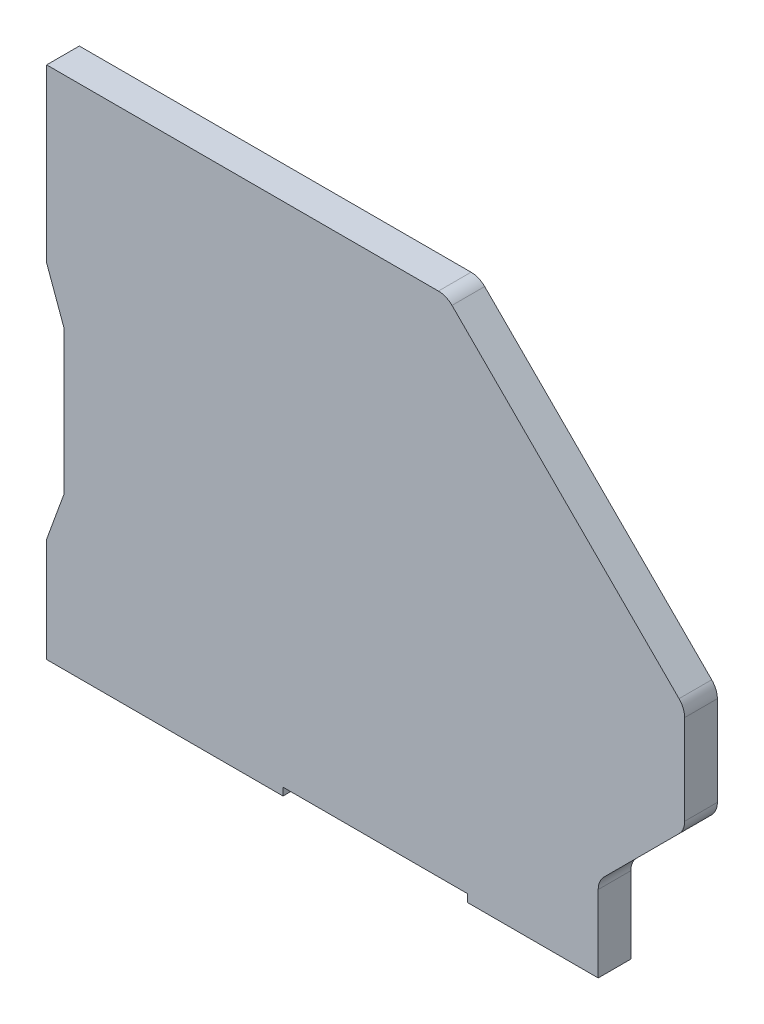
ISO-10303-21;
HEADER;
FILE_DESCRIPTION(('STEP AP214'),'2;1');
FILE_NAME('part.step','',(''),(''),'','','');
FILE_SCHEMA(('AUTOMOTIVE_DESIGN { 1 0 10303 214 1 1 1 1 }'));
ENDSEC;
DATA;
#1=APPLICATION_CONTEXT('core data for automotive mechanical design processes');
#2=APPLICATION_PROTOCOL_DEFINITION('international standard','automotive_design',2000,#1);
#3=PRODUCT_CONTEXT('',#1,'mechanical');
#4=PRODUCT('Part','Part','',(#3));
#5=PRODUCT_RELATED_PRODUCT_CATEGORY('part','',(#4));
#6=PRODUCT_DEFINITION_FORMATION('','',#4);
#7=PRODUCT_DEFINITION_CONTEXT('part definition',#1,'design');
#8=PRODUCT_DEFINITION('design','',#6,#7);
#9=PRODUCT_DEFINITION_SHAPE('','',#8);
#10=(LENGTH_UNIT() NAMED_UNIT(*) SI_UNIT(.MILLI.,.METRE.));
#11=(NAMED_UNIT(*) PLANE_ANGLE_UNIT() SI_UNIT($,.RADIAN.));
#12=(NAMED_UNIT(*) SI_UNIT($,.STERADIAN.) SOLID_ANGLE_UNIT());
#13=UNCERTAINTY_MEASURE_WITH_UNIT(LENGTH_MEASURE(1.E-05),#10,'distance_accuracy_value','');
#14=(GEOMETRIC_REPRESENTATION_CONTEXT(3) GLOBAL_UNCERTAINTY_ASSIGNED_CONTEXT((#13)) GLOBAL_UNIT_ASSIGNED_CONTEXT((#10,
#11,#12)) REPRESENTATION_CONTEXT('',''));
#15=CARTESIAN_POINT('',(0.,0.,0.));
#16=DIRECTION('',(0.,0.,1.));
#17=DIRECTION('',(1.,0.,0.));
#18=AXIS2_PLACEMENT_3D('',#15,#16,#17);
#19=CARTESIAN_POINT('',(-2.6,0.,0.));
#20=DIRECTION('',(-1.,0.,0.));
#21=DIRECTION('',(0.,0.,1.));
#22=AXIS2_PLACEMENT_3D('',#19,#20,#21);
#23=PLANE('',#22);
#24=DIRECTION('',(0.,1.,0.));
#25=VECTOR('',#24,1.);
#26=CARTESIAN_POINT('',(-2.6,0.,0.));
#27=LINE('',#26,#25);
#28=CARTESIAN_POINT('',(-2.6,0.4,0.));
#29=VERTEX_POINT('',#28);
#30=CARTESIAN_POINT('',(-2.6,0.,0.));
#31=VERTEX_POINT('',#30);
#32=EDGE_CURVE('E157',#29,#31,#27,.F.);
#33=ORIENTED_EDGE('',*,*,#32,.T.);
#34=DIRECTION('',(0.,0.,-1.));
#35=VECTOR('',#34,1.);
#36=CARTESIAN_POINT('',(-2.6,0.,0.));
#37=LINE('',#36,#35);
#38=CARTESIAN_POINT('',(-2.6,0.,1.7));
#39=VERTEX_POINT('',#38);
#40=EDGE_CURVE('E240',#39,#31,#37,.T.);
#41=ORIENTED_EDGE('',*,*,#40,.F.);
#42=DIRECTION('',(0.,1.,0.));
#43=VECTOR('',#42,1.);
#44=CARTESIAN_POINT('',(-2.6,12.6002823694556,1.7));
#45=LINE('',#44,#43);
#46=CARTESIAN_POINT('',(-2.6,0.399999999999999,1.7));
#47=VERTEX_POINT('',#46);
#48=EDGE_CURVE('E285',#47,#39,#45,.F.);
#49=ORIENTED_EDGE('',*,*,#48,.F.);
#50=DIRECTION('',(0.,0.,-1.));
#51=VECTOR('',#50,1.);
#52=CARTESIAN_POINT('',(-2.6,0.4,0.));
#53=LINE('',#52,#51);
#54=EDGE_CURVE('E249',#29,#47,#53,.F.);
#55=ORIENTED_EDGE('',*,*,#54,.F.);
#56=EDGE_LOOP('',(#33,#41,#49,#55));
#57=FACE_BOUND('',#56,.T.);
#58=ADVANCED_FACE('F16',(#57),#23,.T.);
#59=CARTESIAN_POINT('',(5.19999999999982,3.98578643762698,0.));
#60=DIRECTION('',(0.,0.,1.));
#61=DIRECTION('',(1.,0.,0.));
#62=AXIS2_PLACEMENT_3D('',#59,#60,#61);
#63=CYLINDRICAL_SURFACE('',#62,0.999999999999821);
#64=DIRECTION('',(0.,0.,-1.));
#65=VECTOR('',#64,1.);
#66=CARTESIAN_POINT('',(4.2,3.9857864376269,0.));
#67=LINE('',#66,#65);
#68=CARTESIAN_POINT('',(4.2,3.98578643762694,0.));
#69=VERTEX_POINT('',#68);
#70=CARTESIAN_POINT('',(4.2,3.98578643762694,1.7));
#71=VERTEX_POINT('',#70);
#72=EDGE_CURVE('E159',#69,#71,#67,.F.);
#73=ORIENTED_EDGE('',*,*,#72,.F.);
#74=CARTESIAN_POINT('',(5.19999999999982,3.98578643762698,0.));
#75=DIRECTION('',(0.,0.,1.));
#76=DIRECTION('',(1.,0.,0.));
#77=AXIS2_PLACEMENT_3D('',#74,#75,#76);
#78=CIRCLE('',#77,0.999999999999821);
#79=CARTESIAN_POINT('',(4.49289321881345,4.69289321881344,0.));
#80=VERTEX_POINT('',#79);
#81=EDGE_CURVE('E19',#80,#69,#78,.T.);
#82=ORIENTED_EDGE('',*,*,#81,.F.);
#83=DIRECTION('',(0.,0.,1.));
#84=VECTOR('',#83,1.);
#85=CARTESIAN_POINT('',(4.4928932188135,4.6928932188135,0.));
#86=LINE('',#85,#84);
#87=CARTESIAN_POINT('',(4.49289321881345,4.69289321881344,1.7));
#88=VERTEX_POINT('',#87);
#89=EDGE_CURVE('E229',#88,#80,#86,.F.);
#90=ORIENTED_EDGE('',*,*,#89,.F.);
#91=CARTESIAN_POINT('',(5.19999999999982,3.98578643762698,1.7));
#92=DIRECTION('',(0.,0.,1.));
#93=DIRECTION('',(1.,0.,0.));
#94=AXIS2_PLACEMENT_3D('',#91,#92,#93);
#95=CIRCLE('',#94,0.999999999999821);
#96=EDGE_CURVE('E161',#71,#88,#95,.F.);
#97=ORIENTED_EDGE('',*,*,#96,.F.);
#98=EDGE_LOOP('',(#73,#82,#90,#97));
#99=FACE_BOUND('',#98,.T.);
#100=ADVANCED_FACE('F160',(#99),#63,.F.);
#101=CARTESIAN_POINT('',(7.70000000000064,9.31421356237293,0.));
#102=DIRECTION('',(0.,0.,1.));
#103=DIRECTION('',(1.,0.,0.));
#104=AXIS2_PLACEMENT_3D('',#101,#102,#103);
#105=CYLINDRICAL_SURFACE('',#104,0.999999999999356);
#106=CARTESIAN_POINT('',(7.70000000000064,9.31421356237293,0.));
#107=DIRECTION('',(0.,0.,1.));
#108=DIRECTION('',(1.,0.,0.));
#109=AXIS2_PLACEMENT_3D('',#106,#107,#108);
#110=CIRCLE('',#109,0.999999999999356);
#111=CARTESIAN_POINT('',(8.40710678118662,8.60710678118672,0.));
#112=VERTEX_POINT('',#111);
#113=CARTESIAN_POINT('',(8.7,9.31421356237301,0.));
#114=VERTEX_POINT('',#113);
#115=EDGE_CURVE('E156',#112,#114,#110,.T.);
#116=ORIENTED_EDGE('',*,*,#115,.T.);
#117=DIRECTION('',(0.,0.,-1.));
#118=VECTOR('',#117,1.);
#119=CARTESIAN_POINT('',(8.7,9.3142135623731,0.));
#120=LINE('',#119,#118);
#121=CARTESIAN_POINT('',(8.7,9.31421356237301,1.7));
#122=VERTEX_POINT('',#121);
#123=EDGE_CURVE('E222',#122,#114,#120,.T.);
#124=ORIENTED_EDGE('',*,*,#123,.F.);
#125=CARTESIAN_POINT('',(7.70000000000064,9.31421356237293,1.7));
#126=DIRECTION('',(0.,0.,1.));
#127=DIRECTION('',(1.,0.,0.));
#128=AXIS2_PLACEMENT_3D('',#125,#126,#127);
#129=CIRCLE('',#128,0.999999999999356);
#130=CARTESIAN_POINT('',(8.40710678118662,8.60710678118672,1.7));
#131=VERTEX_POINT('',#130);
#132=EDGE_CURVE('E304',#131,#122,#129,.T.);
#133=ORIENTED_EDGE('',*,*,#132,.F.);
#134=DIRECTION('',(0.,0.,1.));
#135=VECTOR('',#134,1.);
#136=CARTESIAN_POINT('',(8.4071067811865,8.6071067811866,0.));
#137=LINE('',#136,#135);
#138=EDGE_CURVE('E231',#112,#131,#137,.T.);
#139=ORIENTED_EDGE('',*,*,#138,.F.);
#140=EDGE_LOOP('',(#116,#124,#133,#139));
#141=FACE_BOUND('',#140,.T.);
#142=ADVANCED_FACE('F312',(#141),#105,.T.);
#143=CARTESIAN_POINT('',(7.7000000000025,13.9857864376274,0.));
#144=DIRECTION('',(0.,0.,1.));
#145=DIRECTION('',(1.,0.,0.));
#146=AXIS2_PLACEMENT_3D('',#143,#144,#145);
#147=CYLINDRICAL_SURFACE('',#146,0.9999999999975);
#148=CARTESIAN_POINT('',(7.7000000000025,13.9857864376274,0.));
#149=DIRECTION('',(0.,0.,1.));
#150=DIRECTION('',(1.,0.,0.));
#151=AXIS2_PLACEMENT_3D('',#148,#149,#150);
#152=CIRCLE('',#151,0.9999999999975);
#153=CARTESIAN_POINT('',(8.7,13.9857864376272,0.));
#154=VERTEX_POINT('',#153);
#155=CARTESIAN_POINT('',(8.4071067811869,14.6928932188126,0.));
#156=VERTEX_POINT('',#155);
#157=EDGE_CURVE('E308',#154,#156,#152,.T.);
#158=ORIENTED_EDGE('',*,*,#157,.T.);
#159=DIRECTION('',(0.,0.,1.));
#160=VECTOR('',#159,1.);
#161=CARTESIAN_POINT('',(8.4071067811865,14.692893218813,0.));
#162=LINE('',#161,#160);
#163=CARTESIAN_POINT('',(8.4071067811869,14.6928932188126,1.7));
#164=VERTEX_POINT('',#163);
#165=EDGE_CURVE('E215',#164,#156,#162,.F.);
#166=ORIENTED_EDGE('',*,*,#165,.F.);
#167=CARTESIAN_POINT('',(7.7000000000025,13.9857864376274,1.7));
#168=DIRECTION('',(0.,0.,1.));
#169=DIRECTION('',(1.,0.,0.));
#170=AXIS2_PLACEMENT_3D('',#167,#168,#169);
#171=CIRCLE('',#170,0.9999999999975);
#172=CARTESIAN_POINT('',(8.7,13.9857864376272,1.7));
#173=VERTEX_POINT('',#172);
#174=EDGE_CURVE('E302',#173,#164,#171,.T.);
#175=ORIENTED_EDGE('',*,*,#174,.F.);
#176=DIRECTION('',(0.,0.,-1.));
#177=VECTOR('',#176,1.);
#178=CARTESIAN_POINT('',(8.7,13.985786437627,0.));
#179=LINE('',#178,#177);
#180=EDGE_CURVE('E225',#154,#173,#179,.F.);
#181=ORIENTED_EDGE('',*,*,#180,.F.);
#182=EDGE_LOOP('',(#158,#166,#175,#181));
#183=FACE_BOUND('',#182,.T.);
#184=ADVANCED_FACE('F373',(#183),#147,.T.);
#185=CARTESIAN_POINT('',(-4.11421356237489,25.7999999999944,0.));
#186=DIRECTION('',(0.,0.,1.));
#187=DIRECTION('',(1.,0.,0.));
#188=AXIS2_PLACEMENT_3D('',#185,#186,#187);
#189=CYLINDRICAL_SURFACE('',#188,1.00000000000555);
#190=CARTESIAN_POINT('',(-4.11421356237489,25.7999999999944,0.));
#191=DIRECTION('',(0.,0.,1.));
#192=DIRECTION('',(1.,0.,0.));
#193=AXIS2_PLACEMENT_3D('',#190,#191,#192);
#194=CIRCLE('',#193,1.00000000000555);
#195=CARTESIAN_POINT('',(-3.40710678118544,26.507106781186,0.));
#196=VERTEX_POINT('',#195);
#197=CARTESIAN_POINT('',(-4.114213562374,26.8,0.));
#198=VERTEX_POINT('',#197);
#199=EDGE_CURVE('E287',#196,#198,#194,.T.);
#200=ORIENTED_EDGE('',*,*,#199,.T.);
#201=DIRECTION('',(0.,0.,1.));
#202=VECTOR('',#201,1.);
#203=CARTESIAN_POINT('',(-4.1142135623731,26.8,0.));
#204=LINE('',#203,#202);
#205=CARTESIAN_POINT('',(-4.114213562374,26.8,1.7));
#206=VERTEX_POINT('',#205);
#207=EDGE_CURVE('E198',#206,#198,#204,.F.);
#208=ORIENTED_EDGE('',*,*,#207,.F.);
#209=CARTESIAN_POINT('',(-4.11421356237489,25.7999999999944,1.7));
#210=DIRECTION('',(0.,0.,1.));
#211=DIRECTION('',(1.,0.,0.));
#212=AXIS2_PLACEMENT_3D('',#209,#210,#211);
#213=CIRCLE('',#212,1.00000000000555);
#214=CARTESIAN_POINT('',(-3.40710678118544,26.507106781186,1.7));
#215=VERTEX_POINT('',#214);
#216=EDGE_CURVE('E255',#215,#206,#213,.T.);
#217=ORIENTED_EDGE('',*,*,#216,.F.);
#218=DIRECTION('',(0.,0.,1.));
#219=VECTOR('',#218,1.);
#220=CARTESIAN_POINT('',(-3.4071067811865,26.507106781187,0.));
#221=LINE('',#220,#219);
#222=EDGE_CURVE('E218',#196,#215,#221,.T.);
#223=ORIENTED_EDGE('',*,*,#222,.F.);
#224=EDGE_LOOP('',(#200,#208,#217,#223));
#225=FACE_BOUND('',#224,.T.);
#226=ADVANCED_FACE('F366',(#225),#189,.T.);
#227=CARTESIAN_POINT('',(-9.8639304558619,12.6002823694556,1.7));
#228=DIRECTION('',(0.,0.,1.));
#229=DIRECTION('',(1.,0.,0.));
#230=AXIS2_PLACEMENT_3D('',#227,#228,#229);
#231=PLANE('',#230);
#232=DIRECTION('',(0.,1.,0.));
#233=VECTOR('',#232,1.);
#234=CARTESIAN_POINT('',(-23.6,7.9,1.7));
#235=LINE('',#234,#233);
#236=CARTESIAN_POINT('',(-23.6,7.9,1.7));
#237=VERTEX_POINT('',#236);
#238=CARTESIAN_POINT('',(-23.6,15.4,1.7));
#239=VERTEX_POINT('',#238);
#240=EDGE_CURVE('E195',#237,#239,#235,.T.);
#241=ORIENTED_EDGE('',*,*,#240,.F.);
#242=DIRECTION('',(-0.342020143325663,-0.93969262078591,0.));
#243=VECTOR('',#242,1.);
#244=CARTESIAN_POINT('',(-24.5,5.4272703224908,1.7));
#245=LINE('',#244,#243);
#246=CARTESIAN_POINT('',(-24.5,5.4272703224908,1.7));
#247=VERTEX_POINT('',#246);
#248=EDGE_CURVE('E191',#247,#237,#245,.F.);
#249=ORIENTED_EDGE('',*,*,#248,.F.);
#250=DIRECTION('',(0.,1.,0.));
#251=VECTOR('',#250,1.);
#252=CARTESIAN_POINT('',(-24.5,0.,1.7));
#253=LINE('',#252,#251);
#254=CARTESIAN_POINT('',(-24.5,0.,1.7));
#255=VERTEX_POINT('',#254);
#256=EDGE_CURVE('E187',#255,#247,#253,.T.);
#257=ORIENTED_EDGE('',*,*,#256,.F.);
#258=DIRECTION('',(1.,0.,0.));
#259=VECTOR('',#258,1.);
#260=CARTESIAN_POINT('',(-12.2,0.,1.7));
#261=LINE('',#260,#259);
#262=CARTESIAN_POINT('',(-12.2,0.,1.7));
#263=VERTEX_POINT('',#262);
#264=EDGE_CURVE('E183',#263,#255,#261,.F.);
#265=ORIENTED_EDGE('',*,*,#264,.F.);
#266=DIRECTION('',(0.,1.,0.));
#267=VECTOR('',#266,1.);
#268=CARTESIAN_POINT('',(-12.2,0.4,1.7));
#269=LINE('',#268,#267);
#270=CARTESIAN_POINT('',(-12.2,0.4,1.7));
#271=VERTEX_POINT('',#270);
#272=EDGE_CURVE('E253',#271,#263,#269,.F.);
#273=ORIENTED_EDGE('',*,*,#272,.F.);
#274=DIRECTION('',(1.,0.,0.));
#275=VECTOR('',#274,1.);
#276=CARTESIAN_POINT('',(-2.6,0.4,1.7));
#277=LINE('',#276,#275);
#278=EDGE_CURVE('E250',#47,#271,#277,.F.);
#279=ORIENTED_EDGE('',*,*,#278,.F.);
#280=ORIENTED_EDGE('',*,*,#48,.T.);
#281=DIRECTION('',(1.,0.,0.));
#282=VECTOR('',#281,1.);
#283=CARTESIAN_POINT('',(4.2,0.,1.7));
#284=LINE('',#283,#282);
#285=CARTESIAN_POINT('',(4.2,0.,1.7));
#286=VERTEX_POINT('',#285);
#287=EDGE_CURVE('E243',#286,#39,#284,.F.);
#288=ORIENTED_EDGE('',*,*,#287,.F.);
#289=DIRECTION('',(0.,1.,0.));
#290=VECTOR('',#289,1.);
#291=CARTESIAN_POINT('',(4.2,3.9857864376269,1.7));
#292=LINE('',#291,#290);
#293=EDGE_CURVE('E235',#71,#286,#292,.F.);
#294=ORIENTED_EDGE('',*,*,#293,.F.);
#295=ORIENTED_EDGE('',*,*,#96,.T.);
#296=DIRECTION('',(0.707106781186538,0.707106781186557,0.));
#297=VECTOR('',#296,1.);
#298=CARTESIAN_POINT('',(8.4071067811865,8.6071067811866,1.7));
#299=LINE('',#298,#297);
#300=EDGE_CURVE('E164',#131,#88,#299,.F.);
#301=ORIENTED_EDGE('',*,*,#300,.F.);
#302=ORIENTED_EDGE('',*,*,#132,.T.);
#303=DIRECTION('',(0.,1.,0.));
#304=VECTOR('',#303,1.);
#305=CARTESIAN_POINT('',(8.7,13.985786437627,1.7));
#306=LINE('',#305,#304);
#307=EDGE_CURVE('E226',#173,#122,#306,.F.);
#308=ORIENTED_EDGE('',*,*,#307,.F.);
#309=ORIENTED_EDGE('',*,*,#174,.T.);
#310=DIRECTION('',(-0.707106781186517,0.707106781186578,0.));
#311=VECTOR('',#310,1.);
#312=CARTESIAN_POINT('',(-3.4071067811865,26.507106781187,1.7));
#313=LINE('',#312,#311);
#314=EDGE_CURVE('E219',#215,#164,#313,.F.);
#315=ORIENTED_EDGE('',*,*,#314,.F.);
#316=ORIENTED_EDGE('',*,*,#216,.T.);
#317=DIRECTION('',(1.,0.,0.));
#318=VECTOR('',#317,1.);
#319=CARTESIAN_POINT('',(-24.5,26.8,1.7));
#320=LINE('',#319,#318);
#321=CARTESIAN_POINT('',(-24.5,26.8,1.7));
#322=VERTEX_POINT('',#321);
#323=EDGE_CURVE('E202',#322,#206,#320,.T.);
#324=ORIENTED_EDGE('',*,*,#323,.F.);
#325=DIRECTION('',(0.,1.,0.));
#326=VECTOR('',#325,1.);
#327=CARTESIAN_POINT('',(-24.5,17.872729677509,1.7));
#328=LINE('',#327,#326);
#329=CARTESIAN_POINT('',(-24.5,17.872729677509,1.7));
#330=VERTEX_POINT('',#329);
#331=EDGE_CURVE('E201',#330,#322,#328,.T.);
#332=ORIENTED_EDGE('',*,*,#331,.F.);
#333=DIRECTION('',(0.342020143325688,-0.939692620785901,0.));
#334=VECTOR('',#333,1.);
#335=CARTESIAN_POINT('',(-23.6,15.4,1.7));
#336=LINE('',#335,#334);
#337=EDGE_CURVE('E212',#239,#330,#336,.F.);
#338=ORIENTED_EDGE('',*,*,#337,.F.);
#339=EDGE_LOOP('',(#241,#249,#257,#265,#273,#279,#280,#288,#294,#295,#301,#302,#308,#309,#315,
#316,#324,#332,#338));
#340=FACE_BOUND('',#339,.T.);
#341=ADVANCED_FACE('F375',(#340),#231,.T.);
#342=CARTESIAN_POINT('',(-12.2,0.4,0.));
#343=DIRECTION('',(1.,0.,0.));
#344=DIRECTION('',(0.,0.,-1.));
#345=AXIS2_PLACEMENT_3D('',#342,#343,#344);
#346=PLANE('',#345);
#347=DIRECTION('',(0.,1.,0.));
#348=VECTOR('',#347,1.);
#349=CARTESIAN_POINT('',(-12.2,0.4,0.));
#350=LINE('',#349,#348);
#351=CARTESIAN_POINT('',(-12.2,0.,0.));
#352=VERTEX_POINT('',#351);
#353=CARTESIAN_POINT('',(-12.2,0.4,0.));
#354=VERTEX_POINT('',#353);
#355=EDGE_CURVE('E251',#352,#354,#350,.T.);
#356=ORIENTED_EDGE('',*,*,#355,.T.);
#357=DIRECTION('',(0.,0.,-1.));
#358=VECTOR('',#357,1.);
#359=CARTESIAN_POINT('',(-12.2,0.4,0.));
#360=LINE('',#359,#358);
#361=EDGE_CURVE('E246',#271,#354,#360,.T.);
#362=ORIENTED_EDGE('',*,*,#361,.F.);
#363=ORIENTED_EDGE('',*,*,#272,.T.);
#364=DIRECTION('',(0.,0.,-1.));
#365=VECTOR('',#364,1.);
#366=CARTESIAN_POINT('',(-12.2,0.,0.));
#367=LINE('',#366,#365);
#368=EDGE_CURVE('E179',#352,#263,#367,.F.);
#369=ORIENTED_EDGE('',*,*,#368,.F.);
#370=EDGE_LOOP('',(#356,#362,#363,#369));
#371=FACE_BOUND('',#370,.T.);
#372=ADVANCED_FACE('F499',(#371),#346,.T.);
#373=CARTESIAN_POINT('',(-2.6,0.4,0.));
#374=DIRECTION('',(0.,-1.,0.));
#375=DIRECTION('',(0.,0.,-1.));
#376=AXIS2_PLACEMENT_3D('',#373,#374,#375);
#377=PLANE('',#376);
#378=DIRECTION('',(1.,0.,0.));
#379=VECTOR('',#378,1.);
#380=CARTESIAN_POINT('',(-9.86393045586191,0.399999999999999,0.));
#381=LINE('',#380,#379);
#382=EDGE_CURVE('E173',#354,#29,#381,.T.);
#383=ORIENTED_EDGE('',*,*,#382,.T.);
#384=ORIENTED_EDGE('',*,*,#54,.T.);
#385=ORIENTED_EDGE('',*,*,#278,.T.);
#386=ORIENTED_EDGE('',*,*,#361,.T.);
#387=EDGE_LOOP('',(#383,#384,#385,#386));
#388=FACE_BOUND('',#387,.T.);
#389=ADVANCED_FACE('F490',(#388),#377,.T.);
#390=CARTESIAN_POINT('',(4.2,0.,0.));
#391=DIRECTION('',(0.,-1.,0.));
#392=DIRECTION('',(0.,0.,-1.));
#393=AXIS2_PLACEMENT_3D('',#390,#391,#392);
#394=PLANE('',#393);
#395=DIRECTION('',(1.,0.,0.));
#396=VECTOR('',#395,1.);
#397=CARTESIAN_POINT('',(-9.86393045586191,0.,0.));
#398=LINE('',#397,#396);
#399=CARTESIAN_POINT('',(4.2,0.,0.));
#400=VERTEX_POINT('',#399);
#401=EDGE_CURVE('E169',#31,#400,#398,.T.);
#402=ORIENTED_EDGE('',*,*,#401,.T.);
#403=DIRECTION('',(0.,0.,-1.));
#404=VECTOR('',#403,1.);
#405=CARTESIAN_POINT('',(4.2,0.,0.));
#406=LINE('',#405,#404);
#407=EDGE_CURVE('E165',#286,#400,#406,.T.);
#408=ORIENTED_EDGE('',*,*,#407,.F.);
#409=ORIENTED_EDGE('',*,*,#287,.T.);
#410=ORIENTED_EDGE('',*,*,#40,.T.);
#411=EDGE_LOOP('',(#402,#408,#409,#410));
#412=FACE_BOUND('',#411,.T.);
#413=ADVANCED_FACE('F387',(#412),#394,.T.);
#414=CARTESIAN_POINT('',(4.2,3.9857864376269,0.));
#415=DIRECTION('',(1.,0.,0.));
#416=DIRECTION('',(0.,0.,-1.));
#417=AXIS2_PLACEMENT_3D('',#414,#415,#416);
#418=PLANE('',#417);
#419=DIRECTION('',(0.,1.,0.));
#420=VECTOR('',#419,1.);
#421=CARTESIAN_POINT('',(4.2,12.6002823694556,0.));
#422=LINE('',#421,#420);
#423=EDGE_CURVE('E152',#400,#69,#422,.T.);
#424=ORIENTED_EDGE('',*,*,#423,.T.);
#425=ORIENTED_EDGE('',*,*,#72,.T.);
#426=ORIENTED_EDGE('',*,*,#293,.T.);
#427=ORIENTED_EDGE('',*,*,#407,.T.);
#428=EDGE_LOOP('',(#424,#425,#426,#427));
#429=FACE_BOUND('',#428,.T.);
#430=ADVANCED_FACE('F167',(#429),#418,.T.);
#431=CARTESIAN_POINT('',(8.4071067811865,8.6071067811866,0.));
#432=DIRECTION('',(0.707106781186557,-0.707106781186538,0.));
#433=DIRECTION('',(0.707106781186538,0.707106781186557,0.));
#434=AXIS2_PLACEMENT_3D('',#431,#432,#433);
#435=PLANE('',#434);
#436=DIRECTION('',(0.707106781186538,0.707106781186557,0.));
#437=VECTOR('',#436,1.);
#438=CARTESIAN_POINT('',(4.4928932188135,4.6928932188135,0.));
#439=LINE('',#438,#437);
#440=EDGE_CURVE('E155',#80,#112,#439,.T.);
#441=ORIENTED_EDGE('',*,*,#440,.T.);
#442=ORIENTED_EDGE('',*,*,#138,.T.);
#443=ORIENTED_EDGE('',*,*,#300,.T.);
#444=ORIENTED_EDGE('',*,*,#89,.T.);
#445=EDGE_LOOP('',(#441,#442,#443,#444));
#446=FACE_BOUND('',#445,.T.);
#447=ADVANCED_FACE('F378',(#446),#435,.T.);
#448=CARTESIAN_POINT('',(8.7,13.985786437627,0.));
#449=DIRECTION('',(1.,0.,0.));
#450=DIRECTION('',(0.,0.,-1.));
#451=AXIS2_PLACEMENT_3D('',#448,#449,#450);
#452=PLANE('',#451);
#453=DIRECTION('',(0.,1.,0.));
#454=VECTOR('',#453,1.);
#455=CARTESIAN_POINT('',(8.7,12.6002823694556,0.));
#456=LINE('',#455,#454);
#457=EDGE_CURVE('E171',#114,#154,#456,.T.);
#458=ORIENTED_EDGE('',*,*,#457,.T.);
#459=ORIENTED_EDGE('',*,*,#180,.T.);
#460=ORIENTED_EDGE('',*,*,#307,.T.);
#461=ORIENTED_EDGE('',*,*,#123,.T.);
#462=EDGE_LOOP('',(#458,#459,#460,#461));
#463=FACE_BOUND('',#462,.T.);
#464=ADVANCED_FACE('F316',(#463),#452,.T.);
#465=CARTESIAN_POINT('',(-3.4071067811865,26.507106781187,0.));
#466=DIRECTION('',(0.707106781186578,0.707106781186517,0.));
#467=DIRECTION('',(-0.707106781186517,0.707106781186578,0.));
#468=AXIS2_PLACEMENT_3D('',#465,#466,#467);
#469=PLANE('',#468);
#470=DIRECTION('',(-0.707106781186517,0.707106781186578,0.));
#471=VECTOR('',#470,1.);
#472=CARTESIAN_POINT('',(8.4071067811865,14.692893218813,0.));
#473=LINE('',#472,#471);
#474=EDGE_CURVE('E320',#156,#196,#473,.T.);
#475=ORIENTED_EDGE('',*,*,#474,.T.);
#476=ORIENTED_EDGE('',*,*,#222,.T.);
#477=ORIENTED_EDGE('',*,*,#314,.T.);
#478=ORIENTED_EDGE('',*,*,#165,.T.);
#479=EDGE_LOOP('',(#475,#476,#477,#478));
#480=FACE_BOUND('',#479,.T.);
#481=ADVANCED_FACE('F369',(#480),#469,.T.);
#482=CARTESIAN_POINT('',(-24.5,26.8,0.));
#483=DIRECTION('',(0.,1.,0.));
#484=DIRECTION('',(0.,0.,1.));
#485=AXIS2_PLACEMENT_3D('',#482,#483,#484);
#486=PLANE('',#485);
#487=DIRECTION('',(1.,0.,0.));
#488=VECTOR('',#487,1.);
#489=CARTESIAN_POINT('',(-9.86393045586191,26.8,0.));
#490=LINE('',#489,#488);
#491=CARTESIAN_POINT('',(-24.5,26.8,0.));
#492=VERTEX_POINT('',#491);
#493=EDGE_CURVE('E207',#198,#492,#490,.F.);
#494=ORIENTED_EDGE('',*,*,#493,.T.);
#495=DIRECTION('',(0.,0.,1.));
#496=VECTOR('',#495,1.);
#497=CARTESIAN_POINT('',(-24.5,26.8,0.));
#498=LINE('',#497,#496);
#499=EDGE_CURVE('E210',#322,#492,#498,.F.);
#500=ORIENTED_EDGE('',*,*,#499,.F.);
#501=ORIENTED_EDGE('',*,*,#323,.T.);
#502=ORIENTED_EDGE('',*,*,#207,.T.);
#503=EDGE_LOOP('',(#494,#500,#501,#502));
#504=FACE_BOUND('',#503,.T.);
#505=ADVANCED_FACE('F363',(#504),#486,.T.);
#506=CARTESIAN_POINT('',(-24.5,17.872729677509,0.));
#507=DIRECTION('',(-1.,0.,0.));
#508=DIRECTION('',(0.,0.,1.));
#509=AXIS2_PLACEMENT_3D('',#506,#507,#508);
#510=PLANE('',#509);
#511=DIRECTION('',(0.,1.,0.));
#512=VECTOR('',#511,1.);
#513=CARTESIAN_POINT('',(-24.5,12.6002823694556,0.));
#514=LINE('',#513,#512);
#515=CARTESIAN_POINT('',(-24.5,17.872729677509,0.));
#516=VERTEX_POINT('',#515);
#517=EDGE_CURVE('E203',#492,#516,#514,.F.);
#518=ORIENTED_EDGE('',*,*,#517,.T.);
#519=DIRECTION('',(0.,0.,1.));
#520=VECTOR('',#519,1.);
#521=CARTESIAN_POINT('',(-24.5,17.872729677509,0.));
#522=LINE('',#521,#520);
#523=EDGE_CURVE('E197',#330,#516,#522,.F.);
#524=ORIENTED_EDGE('',*,*,#523,.F.);
#525=ORIENTED_EDGE('',*,*,#331,.T.);
#526=ORIENTED_EDGE('',*,*,#499,.T.);
#527=EDGE_LOOP('',(#518,#524,#525,#526));
#528=FACE_BOUND('',#527,.T.);
#529=ADVANCED_FACE('F358',(#528),#510,.T.);
#530=CARTESIAN_POINT('',(-23.6,15.4,0.));
#531=DIRECTION('',(-0.939692620785901,-0.342020143325688,0.));
#532=DIRECTION('',(0.342020143325688,-0.939692620785901,0.));
#533=AXIS2_PLACEMENT_3D('',#530,#531,#532);
#534=PLANE('',#533);
#535=DIRECTION('',(0.342020143325688,-0.939692620785901,0.));
#536=VECTOR('',#535,1.);
#537=CARTESIAN_POINT('',(-24.5,17.872729677509,0.));
#538=LINE('',#537,#536);
#539=CARTESIAN_POINT('',(-23.6,15.4,0.));
#540=VERTEX_POINT('',#539);
#541=EDGE_CURVE('E206',#516,#540,#538,.T.);
#542=ORIENTED_EDGE('',*,*,#541,.T.);
#543=DIRECTION('',(0.,0.,1.));
#544=VECTOR('',#543,1.);
#545=CARTESIAN_POINT('',(-23.6,15.4,0.));
#546=LINE('',#545,#544);
#547=EDGE_CURVE('E193',#239,#540,#546,.F.);
#548=ORIENTED_EDGE('',*,*,#547,.F.);
#549=ORIENTED_EDGE('',*,*,#337,.T.);
#550=ORIENTED_EDGE('',*,*,#523,.T.);
#551=EDGE_LOOP('',(#542,#548,#549,#550));
#552=FACE_BOUND('',#551,.T.);
#553=ADVANCED_FACE('F354',(#552),#534,.T.);
#554=CARTESIAN_POINT('',(-23.6,7.9,0.));
#555=DIRECTION('',(-1.,0.,0.));
#556=DIRECTION('',(0.,0.,1.));
#557=AXIS2_PLACEMENT_3D('',#554,#555,#556);
#558=PLANE('',#557);
#559=DIRECTION('',(0.,1.,0.));
#560=VECTOR('',#559,1.);
#561=CARTESIAN_POINT('',(-23.6,12.6002823694556,0.));
#562=LINE('',#561,#560);
#563=CARTESIAN_POINT('',(-23.6,7.9,0.));
#564=VERTEX_POINT('',#563);
#565=EDGE_CURVE('E330',#540,#564,#562,.F.);
#566=ORIENTED_EDGE('',*,*,#565,.T.);
#567=DIRECTION('',(0.,0.,1.));
#568=VECTOR('',#567,1.);
#569=CARTESIAN_POINT('',(-23.6,7.9,0.));
#570=LINE('',#569,#568);
#571=EDGE_CURVE('E189',#237,#564,#570,.F.);
#572=ORIENTED_EDGE('',*,*,#571,.F.);
#573=ORIENTED_EDGE('',*,*,#240,.T.);
#574=ORIENTED_EDGE('',*,*,#547,.T.);
#575=EDGE_LOOP('',(#566,#572,#573,#574));
#576=FACE_BOUND('',#575,.T.);
#577=ADVANCED_FACE('F348',(#576),#558,.T.);
#578=CARTESIAN_POINT('',(-24.5,5.4272703224908,0.));
#579=DIRECTION('',(-0.93969262078591,0.342020143325663,0.));
#580=DIRECTION('',(-0.342020143325663,-0.93969262078591,0.));
#581=AXIS2_PLACEMENT_3D('',#578,#579,#580);
#582=PLANE('',#581);
#583=DIRECTION('',(-0.342020143325663,-0.93969262078591,0.));
#584=VECTOR('',#583,1.);
#585=CARTESIAN_POINT('',(-23.6,7.9,0.));
#586=LINE('',#585,#584);
#587=CARTESIAN_POINT('',(-24.5,5.4272703224908,0.));
#588=VERTEX_POINT('',#587);
#589=EDGE_CURVE('E333',#564,#588,#586,.T.);
#590=ORIENTED_EDGE('',*,*,#589,.T.);
#591=DIRECTION('',(0.,0.,1.));
#592=VECTOR('',#591,1.);
#593=CARTESIAN_POINT('',(-24.5,5.4272703224908,0.));
#594=LINE('',#593,#592);
#595=EDGE_CURVE('E185',#247,#588,#594,.F.);
#596=ORIENTED_EDGE('',*,*,#595,.F.);
#597=ORIENTED_EDGE('',*,*,#248,.T.);
#598=ORIENTED_EDGE('',*,*,#571,.T.);
#599=EDGE_LOOP('',(#590,#596,#597,#598));
#600=FACE_BOUND('',#599,.T.);
#601=ADVANCED_FACE('F343',(#600),#582,.T.);
#602=CARTESIAN_POINT('',(-24.5,0.,0.));
#603=DIRECTION('',(-1.,0.,0.));
#604=DIRECTION('',(0.,0.,1.));
#605=AXIS2_PLACEMENT_3D('',#602,#603,#604);
#606=PLANE('',#605);
#607=DIRECTION('',(0.,1.,0.));
#608=VECTOR('',#607,1.);
#609=CARTESIAN_POINT('',(-24.5,12.6002823694556,0.));
#610=LINE('',#609,#608);
#611=CARTESIAN_POINT('',(-24.5,0.,0.));
#612=VERTEX_POINT('',#611);
#613=EDGE_CURVE('E25',#588,#612,#610,.F.);
#614=ORIENTED_EDGE('',*,*,#613,.T.);
#615=DIRECTION('',(0.,0.,-1.));
#616=VECTOR('',#615,1.);
#617=CARTESIAN_POINT('',(-24.5,0.,0.));
#618=LINE('',#617,#616);
#619=EDGE_CURVE('E33',#255,#612,#618,.T.);
#620=ORIENTED_EDGE('',*,*,#619,.F.);
#621=ORIENTED_EDGE('',*,*,#256,.T.);
#622=ORIENTED_EDGE('',*,*,#595,.T.);
#623=EDGE_LOOP('',(#614,#620,#621,#622));
#624=FACE_BOUND('',#623,.T.);
#625=ADVANCED_FACE('F338',(#624),#606,.T.);
#626=CARTESIAN_POINT('',(-12.2,0.,0.));
#627=DIRECTION('',(0.,-1.,0.));
#628=DIRECTION('',(0.,0.,-1.));
#629=AXIS2_PLACEMENT_3D('',#626,#627,#628);
#630=PLANE('',#629);
#631=DIRECTION('',(1.,0.,0.));
#632=VECTOR('',#631,1.);
#633=CARTESIAN_POINT('',(-9.86393045586191,0.,0.));
#634=LINE('',#633,#632);
#635=EDGE_CURVE('E11',#612,#352,#634,.T.);
#636=ORIENTED_EDGE('',*,*,#635,.T.);
#637=ORIENTED_EDGE('',*,*,#368,.T.);
#638=ORIENTED_EDGE('',*,*,#264,.T.);
#639=ORIENTED_EDGE('',*,*,#619,.T.);
#640=EDGE_LOOP('',(#636,#637,#638,#639));
#641=FACE_BOUND('',#640,.T.);
#642=ADVANCED_FACE('F390',(#641),#630,.T.);
#643=CARTESIAN_POINT('',(-9.86393045586191,12.6002823694556,0.));
#644=DIRECTION('',(0.,0.,1.));
#645=DIRECTION('',(1.,0.,0.));
#646=AXIS2_PLACEMENT_3D('',#643,#644,#645);
#647=PLANE('',#646);
#648=ORIENTED_EDGE('',*,*,#613,.F.);
#649=ORIENTED_EDGE('',*,*,#589,.F.);
#650=ORIENTED_EDGE('',*,*,#565,.F.);
#651=ORIENTED_EDGE('',*,*,#541,.F.);
#652=ORIENTED_EDGE('',*,*,#517,.F.);
#653=ORIENTED_EDGE('',*,*,#493,.F.);
#654=ORIENTED_EDGE('',*,*,#199,.F.);
#655=ORIENTED_EDGE('',*,*,#474,.F.);
#656=ORIENTED_EDGE('',*,*,#157,.F.);
#657=ORIENTED_EDGE('',*,*,#457,.F.);
#658=ORIENTED_EDGE('',*,*,#115,.F.);
#659=ORIENTED_EDGE('',*,*,#440,.F.);
#660=ORIENTED_EDGE('',*,*,#81,.T.);
#661=ORIENTED_EDGE('',*,*,#423,.F.);
#662=ORIENTED_EDGE('',*,*,#401,.F.);
#663=ORIENTED_EDGE('',*,*,#32,.F.);
#664=ORIENTED_EDGE('',*,*,#382,.F.);
#665=ORIENTED_EDGE('',*,*,#355,.F.);
#666=ORIENTED_EDGE('',*,*,#635,.F.);
#667=EDGE_LOOP('',(#648,#649,#650,#651,#652,#653,#654,#655,#656,#657,#658,#659,#660,#661,#662,
#663,#664,#665,#666));
#668=FACE_BOUND('',#667,.T.);
#669=ADVANCED_FACE('F149',(#668),#647,.F.);
#670=CLOSED_SHELL('',(#58,#100,#142,#184,#226,#341,#372,#389,#413,#430,#447,#464,#481,#505,#529,
#553,#577,#601,#625,#642,#669));
#671=MANIFOLD_SOLID_BREP('B1',#670);
#672=ADVANCED_BREP_SHAPE_REPRESENTATION('',(#18,#671),#14);
#673=SHAPE_DEFINITION_REPRESENTATION(#9,#672);
ENDSEC;
END-ISO-10303-21;
